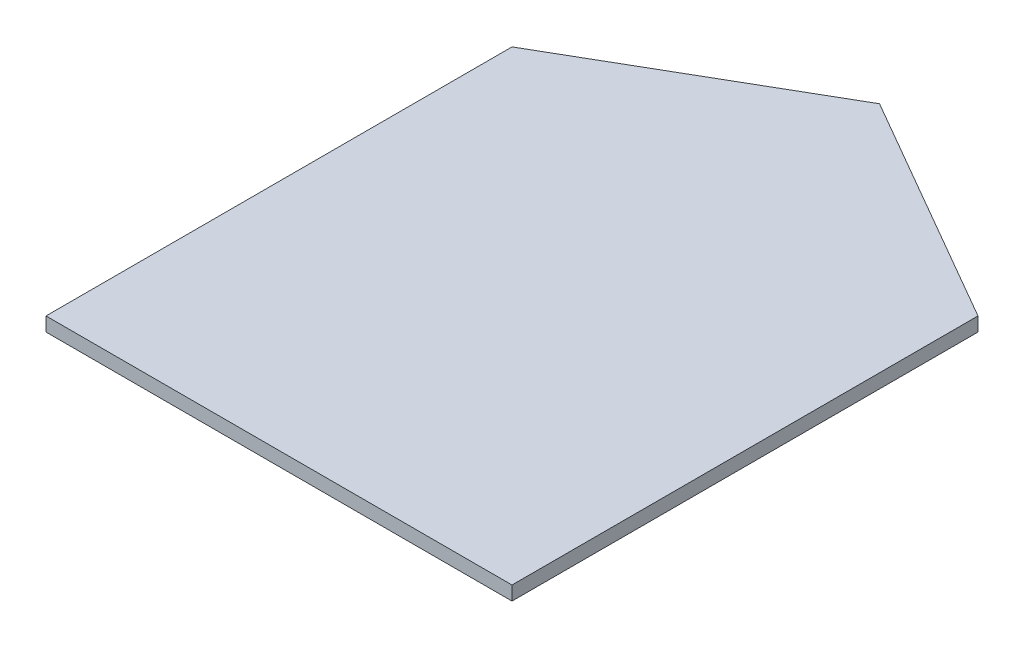
ISO-10303-21;
HEADER;
FILE_DESCRIPTION(('STEP AP214'),'2;1');
FILE_NAME('part.step','',(''),(''),'','','');
FILE_SCHEMA(('AUTOMOTIVE_DESIGN { 1 0 10303 214 1 1 1 1 }'));
ENDSEC;
DATA;
#1=APPLICATION_CONTEXT('core data for automotive mechanical design processes');
#2=APPLICATION_PROTOCOL_DEFINITION('international standard','automotive_design',2000,#1);
#3=PRODUCT_CONTEXT('',#1,'mechanical');
#4=PRODUCT('Part','Part','',(#3));
#5=PRODUCT_RELATED_PRODUCT_CATEGORY('part','',(#4));
#6=PRODUCT_DEFINITION_FORMATION('','',#4);
#7=PRODUCT_DEFINITION_CONTEXT('part definition',#1,'design');
#8=PRODUCT_DEFINITION('design','',#6,#7);
#9=PRODUCT_DEFINITION_SHAPE('','',#8);
#10=(LENGTH_UNIT() NAMED_UNIT(*) SI_UNIT(.MILLI.,.METRE.));
#11=(NAMED_UNIT(*) PLANE_ANGLE_UNIT() SI_UNIT($,.RADIAN.));
#12=(NAMED_UNIT(*) SI_UNIT($,.STERADIAN.) SOLID_ANGLE_UNIT());
#13=UNCERTAINTY_MEASURE_WITH_UNIT(LENGTH_MEASURE(1.E-05),#10,'distance_accuracy_value','');
#14=(GEOMETRIC_REPRESENTATION_CONTEXT(3) GLOBAL_UNCERTAINTY_ASSIGNED_CONTEXT((#13)) GLOBAL_UNIT_ASSIGNED_CONTEXT((#10,
#11,#12)) REPRESENTATION_CONTEXT('',''));
#15=CARTESIAN_POINT('',(0.,0.,0.));
#16=DIRECTION('',(0.,0.,1.));
#17=DIRECTION('',(1.,0.,0.));
#18=AXIS2_PLACEMENT_3D('',#15,#16,#17);
#19=CARTESIAN_POINT('',(0.,3.,-100.000003540519));
#20=DIRECTION('',(1.,0.,0.));
#21=DIRECTION('',(0.,0.,-1.));
#22=AXIS2_PLACEMENT_3D('',#19,#20,#21);
#23=PLANE('',#22);
#24=DIRECTION('',(0.,0.,1.));
#25=VECTOR('',#24,1.);
#26=CARTESIAN_POINT('',(0.,0.,-100.000003540519));
#27=LINE('',#26,#25);
#28=CARTESIAN_POINT('',(0.,0.,-100.000003540519));
#29=VERTEX_POINT('',#28);
#30=CARTESIAN_POINT('',(0.,0.,0.));
#31=VERTEX_POINT('',#30);
#32=EDGE_CURVE('E108',#29,#31,#27,.T.);
#33=ORIENTED_EDGE('',*,*,#32,.T.);
#34=DIRECTION('',(0.,-1.,0.));
#35=VECTOR('',#34,1.);
#36=CARTESIAN_POINT('',(0.,3.,0.));
#37=LINE('',#36,#35);
#38=CARTESIAN_POINT('',(0.,3.,0.));
#39=VERTEX_POINT('',#38);
#40=EDGE_CURVE('E11',#39,#31,#37,.T.);
#41=ORIENTED_EDGE('',*,*,#40,.F.);
#42=DIRECTION('',(0.,0.,1.));
#43=VECTOR('',#42,1.);
#44=CARTESIAN_POINT('',(0.,3.,-100.000003540519));
#45=LINE('',#44,#43);
#46=CARTESIAN_POINT('',(0.,3.,-100.000003540519));
#47=VERTEX_POINT('',#46);
#48=EDGE_CURVE('E116',#47,#39,#45,.T.);
#49=ORIENTED_EDGE('',*,*,#48,.F.);
#50=DIRECTION('',(0.,-1.,0.));
#51=VECTOR('',#50,1.);
#52=CARTESIAN_POINT('',(0.,3.,-100.000003540519));
#53=LINE('',#52,#51);
#54=EDGE_CURVE('E104',#47,#29,#53,.T.);
#55=ORIENTED_EDGE('',*,*,#54,.T.);
#56=EDGE_LOOP('',(#33,#41,#49,#55));
#57=FACE_BOUND('',#56,.T.);
#58=ADVANCED_FACE('F34',(#57),#23,.F.);
#59=CARTESIAN_POINT('',(0.,3.,0.));
#60=DIRECTION('',(0.,0.,-1.));
#61=DIRECTION('',(-1.,0.,0.));
#62=AXIS2_PLACEMENT_3D('',#59,#60,#61);
#63=PLANE('',#62);
#64=DIRECTION('',(1.,0.,0.));
#65=VECTOR('',#64,1.);
#66=CARTESIAN_POINT('',(0.,0.,0.));
#67=LINE('',#66,#65);
#68=CARTESIAN_POINT('',(100.,0.,0.));
#69=VERTEX_POINT('',#68);
#70=EDGE_CURVE('E111',#31,#69,#67,.T.);
#71=ORIENTED_EDGE('',*,*,#70,.T.);
#72=DIRECTION('',(0.,-1.,0.));
#73=VECTOR('',#72,1.);
#74=CARTESIAN_POINT('',(100.,3.,0.));
#75=LINE('',#74,#73);
#76=CARTESIAN_POINT('',(100.,3.,0.));
#77=VERTEX_POINT('',#76);
#78=EDGE_CURVE('E42',#77,#69,#75,.T.);
#79=ORIENTED_EDGE('',*,*,#78,.F.);
#80=DIRECTION('',(1.,0.,0.));
#81=VECTOR('',#80,1.);
#82=CARTESIAN_POINT('',(0.,3.,0.));
#83=LINE('',#82,#81);
#84=EDGE_CURVE('E84',#39,#77,#83,.T.);
#85=ORIENTED_EDGE('',*,*,#84,.F.);
#86=ORIENTED_EDGE('',*,*,#40,.T.);
#87=EDGE_LOOP('',(#71,#79,#85,#86));
#88=FACE_BOUND('',#87,.T.);
#89=ADVANCED_FACE('F135',(#88),#63,.F.);
#90=CARTESIAN_POINT('',(100.,3.,0.));
#91=DIRECTION('',(-1.,0.,0.));
#92=DIRECTION('',(0.,0.,1.));
#93=AXIS2_PLACEMENT_3D('',#90,#91,#92);
#94=PLANE('',#93);
#95=DIRECTION('',(0.,0.,-1.));
#96=VECTOR('',#95,1.);
#97=CARTESIAN_POINT('',(100.,0.,0.));
#98=LINE('',#97,#96);
#99=CARTESIAN_POINT('',(100.,0.,-100.000003540519));
#100=VERTEX_POINT('',#99);
#101=EDGE_CURVE('E99',#69,#100,#98,.T.);
#102=ORIENTED_EDGE('',*,*,#101,.T.);
#103=DIRECTION('',(0.,-1.,0.));
#104=VECTOR('',#103,1.);
#105=CARTESIAN_POINT('',(100.,3.,-100.000003540519));
#106=LINE('',#105,#104);
#107=CARTESIAN_POINT('',(100.,3.,-100.000003540519));
#108=VERTEX_POINT('',#107);
#109=EDGE_CURVE('E96',#108,#100,#106,.T.);
#110=ORIENTED_EDGE('',*,*,#109,.F.);
#111=DIRECTION('',(0.,0.,-1.));
#112=VECTOR('',#111,1.);
#113=CARTESIAN_POINT('',(100.,3.,0.));
#114=LINE('',#113,#112);
#115=EDGE_CURVE('E88',#77,#108,#114,.T.);
#116=ORIENTED_EDGE('',*,*,#115,.F.);
#117=ORIENTED_EDGE('',*,*,#78,.T.);
#118=EDGE_LOOP('',(#102,#110,#116,#117));
#119=FACE_BOUND('',#118,.T.);
#120=ADVANCED_FACE('F97',(#119),#94,.F.);
#121=CARTESIAN_POINT('',(100.,3.,-100.000003540519));
#122=DIRECTION('',(-0.500000000000001,0.,0.866025403784438));
#123=DIRECTION('',(0.866025403784438,0.,0.500000000000001));
#124=AXIS2_PLACEMENT_3D('',#121,#122,#123);
#125=PLANE('',#124);
#126=DIRECTION('',(-0.866025403784438,0.,-0.500000000000001));
#127=VECTOR('',#126,1.);
#128=CARTESIAN_POINT('',(100.,0.,-100.000003540519));
#129=LINE('',#128,#127);
#130=CARTESIAN_POINT('',(50.,0.,-128.867517));
#131=VERTEX_POINT('',#130);
#132=EDGE_CURVE('E70',#100,#131,#129,.T.);
#133=ORIENTED_EDGE('',*,*,#132,.T.);
#134=DIRECTION('',(0.,-1.,0.));
#135=VECTOR('',#134,1.);
#136=CARTESIAN_POINT('',(50.,3.,-128.867517));
#137=LINE('',#136,#135);
#138=CARTESIAN_POINT('',(50.,3.,-128.867517));
#139=VERTEX_POINT('',#138);
#140=EDGE_CURVE('E100',#139,#131,#137,.T.);
#141=ORIENTED_EDGE('',*,*,#140,.F.);
#142=DIRECTION('',(-0.866025403784438,0.,-0.500000000000001));
#143=VECTOR('',#142,1.);
#144=CARTESIAN_POINT('',(100.,3.,-100.000003540519));
#145=LINE('',#144,#143);
#146=EDGE_CURVE('E92',#108,#139,#145,.T.);
#147=ORIENTED_EDGE('',*,*,#146,.F.);
#148=ORIENTED_EDGE('',*,*,#109,.T.);
#149=EDGE_LOOP('',(#133,#141,#147,#148));
#150=FACE_BOUND('',#149,.T.);
#151=ADVANCED_FACE('F102',(#150),#125,.F.);
#152=CARTESIAN_POINT('',(50.,3.,-128.867517));
#153=DIRECTION('',(0.500000000000001,0.,0.866025403784438));
#154=DIRECTION('',(0.866025403784438,0.,-0.500000000000001));
#155=AXIS2_PLACEMENT_3D('',#152,#153,#154);
#156=PLANE('',#155);
#157=DIRECTION('',(-0.866025403784438,0.,0.500000000000001));
#158=VECTOR('',#157,1.);
#159=CARTESIAN_POINT('',(50.,0.,-128.867517));
#160=LINE('',#159,#158);
#161=EDGE_CURVE('E76',#131,#29,#160,.T.);
#162=ORIENTED_EDGE('',*,*,#161,.T.);
#163=ORIENTED_EDGE('',*,*,#54,.F.);
#164=DIRECTION('',(-0.866025403784438,0.,0.500000000000001));
#165=VECTOR('',#164,1.);
#166=CARTESIAN_POINT('',(50.,3.,-128.867517));
#167=LINE('',#166,#165);
#168=EDGE_CURVE('E50',#139,#47,#167,.T.);
#169=ORIENTED_EDGE('',*,*,#168,.F.);
#170=ORIENTED_EDGE('',*,*,#140,.T.);
#171=EDGE_LOOP('',(#162,#163,#169,#170));
#172=FACE_BOUND('',#171,.T.);
#173=ADVANCED_FACE('F124',(#172),#156,.F.);
#174=CARTESIAN_POINT('',(0.,3.,0.));
#175=DIRECTION('',(0.,1.,0.));
#176=DIRECTION('',(0.,0.,1.));
#177=AXIS2_PLACEMENT_3D('',#174,#175,#176);
#178=PLANE('',#177);
#179=ORIENTED_EDGE('',*,*,#48,.T.);
#180=ORIENTED_EDGE('',*,*,#84,.T.);
#181=ORIENTED_EDGE('',*,*,#115,.T.);
#182=ORIENTED_EDGE('',*,*,#146,.T.);
#183=ORIENTED_EDGE('',*,*,#168,.T.);
#184=EDGE_LOOP('',(#179,#180,#181,#182,#183));
#185=FACE_BOUND('',#184,.T.);
#186=ADVANCED_FACE('F90',(#185),#178,.T.);
#187=CARTESIAN_POINT('',(0.,0.,0.));
#188=DIRECTION('',(0.,1.,0.));
#189=DIRECTION('',(0.,0.,1.));
#190=AXIS2_PLACEMENT_3D('',#187,#188,#189);
#191=PLANE('',#190);
#192=ORIENTED_EDGE('',*,*,#32,.F.);
#193=ORIENTED_EDGE('',*,*,#161,.F.);
#194=ORIENTED_EDGE('',*,*,#132,.F.);
#195=ORIENTED_EDGE('',*,*,#101,.F.);
#196=ORIENTED_EDGE('',*,*,#70,.F.);
#197=EDGE_LOOP('',(#192,#193,#194,#195,#196));
#198=FACE_BOUND('',#197,.T.);
#199=ADVANCED_FACE('F120',(#198),#191,.F.);
#200=CLOSED_SHELL('',(#58,#89,#120,#151,#173,#186,#199));
#201=MANIFOLD_SOLID_BREP('B2',#200);
#202=ADVANCED_BREP_SHAPE_REPRESENTATION('',(#18,#201),#14);
#203=SHAPE_DEFINITION_REPRESENTATION(#9,#202);
ENDSEC;
END-ISO-10303-21;
